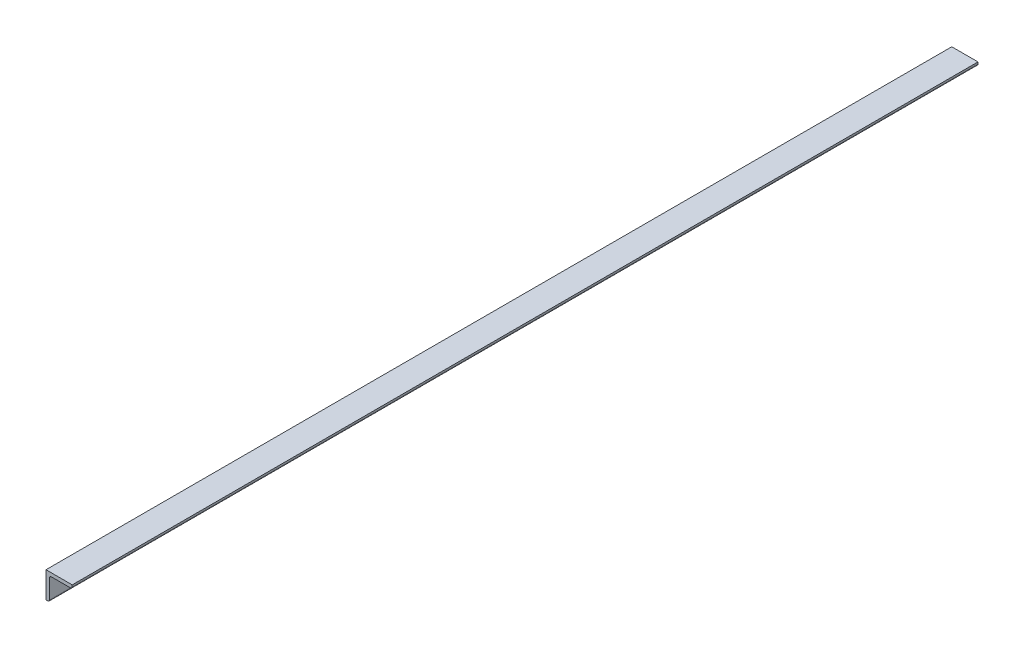
ISO-10303-21;
HEADER;
FILE_DESCRIPTION(('STEP AP214'),'2;1');
FILE_NAME('part.step','',(''),(''),'','','');
FILE_SCHEMA(('AUTOMOTIVE_DESIGN { 1 0 10303 214 1 1 1 1 }'));
ENDSEC;
DATA;
#1=APPLICATION_CONTEXT('core data for automotive mechanical design processes');
#2=APPLICATION_PROTOCOL_DEFINITION('international standard','automotive_design',2000,#1);
#3=PRODUCT_CONTEXT('',#1,'mechanical');
#4=PRODUCT('Part','Part','',(#3));
#5=PRODUCT_RELATED_PRODUCT_CATEGORY('part','',(#4));
#6=PRODUCT_DEFINITION_FORMATION('','',#4);
#7=PRODUCT_DEFINITION_CONTEXT('part definition',#1,'design');
#8=PRODUCT_DEFINITION('design','',#6,#7);
#9=PRODUCT_DEFINITION_SHAPE('','',#8);
#10=(LENGTH_UNIT() NAMED_UNIT(*) SI_UNIT(.MILLI.,.METRE.));
#11=(NAMED_UNIT(*) PLANE_ANGLE_UNIT() SI_UNIT($,.RADIAN.));
#12=(NAMED_UNIT(*) SI_UNIT($,.STERADIAN.) SOLID_ANGLE_UNIT());
#13=UNCERTAINTY_MEASURE_WITH_UNIT(LENGTH_MEASURE(1.E-05),#10,'distance_accuracy_value','');
#14=(GEOMETRIC_REPRESENTATION_CONTEXT(3) GLOBAL_UNCERTAINTY_ASSIGNED_CONTEXT((#13)) GLOBAL_UNIT_ASSIGNED_CONTEXT((#10,
#11,#12)) REPRESENTATION_CONTEXT('',''));
#15=CARTESIAN_POINT('',(0.,0.,0.));
#16=DIRECTION('',(0.,0.,1.));
#17=DIRECTION('',(1.,0.,0.));
#18=AXIS2_PLACEMENT_3D('',#15,#16,#17);
#19=CARTESIAN_POINT('',(-8.62500000000004,36.8125,1036.));
#20=DIRECTION('',(-1.,0.,0.));
#21=DIRECTION('',(0.,0.,1.));
#22=AXIS2_PLACEMENT_3D('',#19,#20,#21);
#23=PLANE('',#22);
#24=DIRECTION('',(0.,1.,0.));
#25=VECTOR('',#24,1.);
#26=CARTESIAN_POINT('',(-8.62500000000004,36.8125,0.));
#27=LINE('',#26,#25);
#28=CARTESIAN_POINT('',(-8.62500000000004,36.8125,0.));
#29=VERTEX_POINT('',#28);
#30=CARTESIAN_POINT('',(-8.62500000000004,38.8125,0.));
#31=VERTEX_POINT('',#30);
#32=EDGE_CURVE('E135',#29,#31,#27,.T.);
#33=ORIENTED_EDGE('',*,*,#32,.T.);
#34=DIRECTION('',(0.,0.,-1.));
#35=VECTOR('',#34,1.);
#36=CARTESIAN_POINT('',(-8.62500000000004,38.8125,1036.));
#37=LINE('',#36,#35);
#38=CARTESIAN_POINT('',(-8.62500000000004,38.8125,1036.));
#39=VERTEX_POINT('',#38);
#40=EDGE_CURVE('E11',#39,#31,#37,.T.);
#41=ORIENTED_EDGE('',*,*,#40,.F.);
#42=DIRECTION('',(0.,1.,0.));
#43=VECTOR('',#42,1.);
#44=CARTESIAN_POINT('',(-8.62500000000004,36.8125,1036.));
#45=LINE('',#44,#43);
#46=CARTESIAN_POINT('',(-8.62500000000004,36.8125,1036.));
#47=VERTEX_POINT('',#46);
#48=EDGE_CURVE('E151',#47,#39,#45,.T.);
#49=ORIENTED_EDGE('',*,*,#48,.F.);
#50=DIRECTION('',(0.,0.,-1.));
#51=VECTOR('',#50,1.);
#52=CARTESIAN_POINT('',(-8.62500000000004,36.8125,1036.));
#53=LINE('',#52,#51);
#54=EDGE_CURVE('E131',#47,#29,#53,.T.);
#55=ORIENTED_EDGE('',*,*,#54,.T.);
#56=EDGE_LOOP('',(#33,#41,#49,#55));
#57=FACE_BOUND('',#56,.T.);
#58=ADVANCED_FACE('F33',(#57),#23,.F.);
#59=CARTESIAN_POINT('',(-8.62500000000004,38.8125,1036.));
#60=DIRECTION('',(0.,-1.,0.));
#61=DIRECTION('',(1.,0.,0.));
#62=AXIS2_PLACEMENT_3D('',#59,#60,#61);
#63=PLANE('',#62);
#64=DIRECTION('',(-1.,0.,0.));
#65=VECTOR('',#64,1.);
#66=CARTESIAN_POINT('',(-8.62500000000004,38.8125,0.));
#67=LINE('',#66,#65);
#68=CARTESIAN_POINT('',(-38.625,38.8125,0.));
#69=VERTEX_POINT('',#68);
#70=EDGE_CURVE('E138',#31,#69,#67,.T.);
#71=ORIENTED_EDGE('',*,*,#70,.T.);
#72=DIRECTION('',(0.,0.,-1.));
#73=VECTOR('',#72,1.);
#74=CARTESIAN_POINT('',(-38.625,38.8125,1036.));
#75=LINE('',#74,#73);
#76=CARTESIAN_POINT('',(-38.625,38.8125,1036.));
#77=VERTEX_POINT('',#76);
#78=EDGE_CURVE('E41',#77,#69,#75,.T.);
#79=ORIENTED_EDGE('',*,*,#78,.F.);
#80=DIRECTION('',(-1.,0.,0.));
#81=VECTOR('',#80,1.);
#82=CARTESIAN_POINT('',(-8.62500000000004,38.8125,1036.));
#83=LINE('',#82,#81);
#84=EDGE_CURVE('E95',#39,#77,#83,.T.);
#85=ORIENTED_EDGE('',*,*,#84,.F.);
#86=ORIENTED_EDGE('',*,*,#40,.T.);
#87=EDGE_LOOP('',(#71,#79,#85,#86));
#88=FACE_BOUND('',#87,.T.);
#89=ADVANCED_FACE('F194',(#88),#63,.F.);
#90=CARTESIAN_POINT('',(-38.625,38.8125,1036.));
#91=DIRECTION('',(1.,0.,0.));
#92=DIRECTION('',(0.,1.,0.));
#93=AXIS2_PLACEMENT_3D('',#90,#91,#92);
#94=PLANE('',#93);
#95=DIRECTION('',(0.,-1.,0.));
#96=VECTOR('',#95,1.);
#97=CARTESIAN_POINT('',(-38.625,38.8125,0.));
#98=LINE('',#97,#96);
#99=CARTESIAN_POINT('',(-38.625,8.81250000000001,0.));
#100=VERTEX_POINT('',#99);
#101=EDGE_CURVE('E140',#69,#100,#98,.T.);
#102=ORIENTED_EDGE('',*,*,#101,.T.);
#103=DIRECTION('',(0.,0.,-1.));
#104=VECTOR('',#103,1.);
#105=CARTESIAN_POINT('',(-38.625,8.81250000000001,1036.));
#106=LINE('',#105,#104);
#107=CARTESIAN_POINT('',(-38.625,8.81250000000001,1036.));
#108=VERTEX_POINT('',#107);
#109=EDGE_CURVE('E161',#108,#100,#106,.T.);
#110=ORIENTED_EDGE('',*,*,#109,.F.);
#111=DIRECTION('',(0.,-1.,0.));
#112=VECTOR('',#111,1.);
#113=CARTESIAN_POINT('',(-38.625,38.8125,1036.));
#114=LINE('',#113,#112);
#115=EDGE_CURVE('E169',#77,#108,#114,.T.);
#116=ORIENTED_EDGE('',*,*,#115,.F.);
#117=ORIENTED_EDGE('',*,*,#78,.T.);
#118=EDGE_LOOP('',(#102,#110,#116,#117));
#119=FACE_BOUND('',#118,.T.);
#120=ADVANCED_FACE('F167',(#119),#94,.F.);
#121=CARTESIAN_POINT('',(-38.625,8.81250000000001,1036.));
#122=DIRECTION('',(0.,1.,0.));
#123=DIRECTION('',(0.,0.,1.));
#124=AXIS2_PLACEMENT_3D('',#121,#122,#123);
#125=PLANE('',#124);
#126=DIRECTION('',(1.,0.,0.));
#127=VECTOR('',#126,1.);
#128=CARTESIAN_POINT('',(-38.625,8.81250000000001,0.));
#129=LINE('',#128,#127);
#130=CARTESIAN_POINT('',(-36.625,8.81250000000001,0.));
#131=VERTEX_POINT('',#130);
#132=EDGE_CURVE('E142',#100,#131,#129,.T.);
#133=ORIENTED_EDGE('',*,*,#132,.T.);
#134=DIRECTION('',(0.,0.,-1.));
#135=VECTOR('',#134,1.);
#136=CARTESIAN_POINT('',(-36.625,8.81250000000001,1036.));
#137=LINE('',#136,#135);
#138=CARTESIAN_POINT('',(-36.625,8.81250000000001,1036.));
#139=VERTEX_POINT('',#138);
#140=EDGE_CURVE('E158',#139,#131,#137,.T.);
#141=ORIENTED_EDGE('',*,*,#140,.F.);
#142=DIRECTION('',(1.,0.,0.));
#143=VECTOR('',#142,1.);
#144=CARTESIAN_POINT('',(-38.625,8.81250000000001,1036.));
#145=LINE('',#144,#143);
#146=EDGE_CURVE('E185',#108,#139,#145,.T.);
#147=ORIENTED_EDGE('',*,*,#146,.F.);
#148=ORIENTED_EDGE('',*,*,#109,.T.);
#149=EDGE_LOOP('',(#133,#141,#147,#148));
#150=FACE_BOUND('',#149,.T.);
#151=ADVANCED_FACE('F178',(#150),#125,.F.);
#152=CARTESIAN_POINT('',(-36.625,10.8125,1036.));
#153=DIRECTION('',(0.,0.,-1.));
#154=DIRECTION('',(-1.,0.,0.));
#155=AXIS2_PLACEMENT_3D('',#152,#153,#154);
#156=CYLINDRICAL_SURFACE('',#155,2.);
#157=CARTESIAN_POINT('',(-36.625,10.8125,0.));
#158=DIRECTION('',(0.,0.,1.));
#159=DIRECTION('',(1.,0.,0.));
#160=AXIS2_PLACEMENT_3D('',#157,#158,#159);
#161=CIRCLE('',#160,2.);
#162=CARTESIAN_POINT('',(-34.625,10.8125,0.));
#163=VERTEX_POINT('',#162);
#164=EDGE_CURVE('E144',#131,#163,#161,.T.);
#165=ORIENTED_EDGE('',*,*,#164,.T.);
#166=DIRECTION('',(0.,0.,-1.));
#167=VECTOR('',#166,1.);
#168=CARTESIAN_POINT('',(-34.625,10.8125,1036.));
#169=LINE('',#168,#167);
#170=CARTESIAN_POINT('',(-34.625,10.8125,1036.));
#171=VERTEX_POINT('',#170);
#172=EDGE_CURVE('E155',#171,#163,#169,.T.);
#173=ORIENTED_EDGE('',*,*,#172,.F.);
#174=CARTESIAN_POINT('',(-36.625,10.8125,1036.));
#175=DIRECTION('',(0.,0.,1.));
#176=DIRECTION('',(1.,0.,0.));
#177=AXIS2_PLACEMENT_3D('',#174,#175,#176);
#178=CIRCLE('',#177,2.);
#179=EDGE_CURVE('E184',#139,#171,#178,.T.);
#180=ORIENTED_EDGE('',*,*,#179,.F.);
#181=ORIENTED_EDGE('',*,*,#140,.T.);
#182=EDGE_LOOP('',(#165,#173,#180,#181));
#183=FACE_BOUND('',#182,.T.);
#184=ADVANCED_FACE('F182',(#183),#156,.T.);
#185=CARTESIAN_POINT('',(-34.625,10.8125,1036.));
#186=DIRECTION('',(-1.,0.,0.));
#187=DIRECTION('',(0.,0.,1.));
#188=AXIS2_PLACEMENT_3D('',#185,#186,#187);
#189=PLANE('',#188);
#190=DIRECTION('',(0.,1.,0.));
#191=VECTOR('',#190,1.);
#192=CARTESIAN_POINT('',(-34.625,10.8125,0.));
#193=LINE('',#192,#191);
#194=CARTESIAN_POINT('',(-34.625,32.8125,0.));
#195=VERTEX_POINT('',#194);
#196=EDGE_CURVE('E146',#163,#195,#193,.T.);
#197=ORIENTED_EDGE('',*,*,#196,.T.);
#198=DIRECTION('',(0.,0.,-1.));
#199=VECTOR('',#198,1.);
#200=CARTESIAN_POINT('',(-34.625,32.8125,1036.));
#201=LINE('',#200,#199);
#202=CARTESIAN_POINT('',(-34.625,32.8125,1036.));
#203=VERTEX_POINT('',#202);
#204=EDGE_CURVE('E126',#203,#195,#201,.T.);
#205=ORIENTED_EDGE('',*,*,#204,.F.);
#206=DIRECTION('',(0.,1.,0.));
#207=VECTOR('',#206,1.);
#208=CARTESIAN_POINT('',(-34.625,10.8125,1036.));
#209=LINE('',#208,#207);
#210=EDGE_CURVE('E117',#171,#203,#209,.T.);
#211=ORIENTED_EDGE('',*,*,#210,.F.);
#212=ORIENTED_EDGE('',*,*,#172,.T.);
#213=EDGE_LOOP('',(#197,#205,#211,#212));
#214=FACE_BOUND('',#213,.T.);
#215=ADVANCED_FACE('F206',(#214),#189,.F.);
#216=CARTESIAN_POINT('',(-32.625,32.8125,1036.));
#217=DIRECTION('',(0.,0.,-1.));
#218=DIRECTION('',(-1.,0.,0.));
#219=AXIS2_PLACEMENT_3D('',#216,#217,#218);
#220=CYLINDRICAL_SURFACE('',#219,2.);
#221=CARTESIAN_POINT('',(-32.625,32.8125,0.));
#222=DIRECTION('',(0.,0.,-1.));
#223=DIRECTION('',(-1.,0.,0.));
#224=AXIS2_PLACEMENT_3D('',#221,#222,#223);
#225=CIRCLE('',#224,2.);
#226=CARTESIAN_POINT('',(-32.625,34.8125,0.));
#227=VERTEX_POINT('',#226);
#228=EDGE_CURVE('E125',#195,#227,#225,.T.);
#229=ORIENTED_EDGE('',*,*,#228,.T.);
#230=DIRECTION('',(0.,0.,-1.));
#231=VECTOR('',#230,1.);
#232=CARTESIAN_POINT('',(-32.625,34.8125,1036.));
#233=LINE('',#232,#231);
#234=CARTESIAN_POINT('',(-32.625,34.8125,1036.));
#235=VERTEX_POINT('',#234);
#236=EDGE_CURVE('E122',#235,#227,#233,.T.);
#237=ORIENTED_EDGE('',*,*,#236,.F.);
#238=CARTESIAN_POINT('',(-32.625,32.8125,1036.));
#239=DIRECTION('',(0.,0.,-1.));
#240=DIRECTION('',(-1.,0.,0.));
#241=AXIS2_PLACEMENT_3D('',#238,#239,#240);
#242=CIRCLE('',#241,2.);
#243=EDGE_CURVE('E111',#203,#235,#242,.T.);
#244=ORIENTED_EDGE('',*,*,#243,.F.);
#245=ORIENTED_EDGE('',*,*,#204,.T.);
#246=EDGE_LOOP('',(#229,#237,#244,#245));
#247=FACE_BOUND('',#246,.T.);
#248=ADVANCED_FACE('F123',(#247),#220,.F.);
#249=CARTESIAN_POINT('',(-32.625,34.8125,1036.));
#250=DIRECTION('',(0.,1.,0.));
#251=DIRECTION('',(0.,0.,1.));
#252=AXIS2_PLACEMENT_3D('',#249,#250,#251);
#253=PLANE('',#252);
#254=DIRECTION('',(1.,0.,0.));
#255=VECTOR('',#254,1.);
#256=CARTESIAN_POINT('',(-32.625,34.8125,0.));
#257=LINE('',#256,#255);
#258=CARTESIAN_POINT('',(-10.625,34.8125,0.));
#259=VERTEX_POINT('',#258);
#260=EDGE_CURVE('E81',#227,#259,#257,.T.);
#261=ORIENTED_EDGE('',*,*,#260,.T.);
#262=DIRECTION('',(0.,0.,-1.));
#263=VECTOR('',#262,1.);
#264=CARTESIAN_POINT('',(-10.625,34.8125,1036.));
#265=LINE('',#264,#263);
#266=CARTESIAN_POINT('',(-10.625,34.8125,1036.));
#267=VERTEX_POINT('',#266);
#268=EDGE_CURVE('E127',#267,#259,#265,.T.);
#269=ORIENTED_EDGE('',*,*,#268,.F.);
#270=DIRECTION('',(1.,0.,0.));
#271=VECTOR('',#270,1.);
#272=CARTESIAN_POINT('',(-32.625,34.8125,1036.));
#273=LINE('',#272,#271);
#274=EDGE_CURVE('E115',#235,#267,#273,.T.);
#275=ORIENTED_EDGE('',*,*,#274,.F.);
#276=ORIENTED_EDGE('',*,*,#236,.T.);
#277=EDGE_LOOP('',(#261,#269,#275,#276));
#278=FACE_BOUND('',#277,.T.);
#279=ADVANCED_FACE('F129',(#278),#253,.F.);
#280=CARTESIAN_POINT('',(-10.625,36.8125,1036.));
#281=DIRECTION('',(0.,0.,-1.));
#282=DIRECTION('',(-1.,0.,0.));
#283=AXIS2_PLACEMENT_3D('',#280,#281,#282);
#284=CYLINDRICAL_SURFACE('',#283,2.);
#285=CARTESIAN_POINT('',(-10.625,36.8125,0.));
#286=DIRECTION('',(0.,0.,1.));
#287=DIRECTION('',(1.,0.,0.));
#288=AXIS2_PLACEMENT_3D('',#285,#286,#287);
#289=CIRCLE('',#288,2.);
#290=EDGE_CURVE('E87',#259,#29,#289,.T.);
#291=ORIENTED_EDGE('',*,*,#290,.T.);
#292=ORIENTED_EDGE('',*,*,#54,.F.);
#293=CARTESIAN_POINT('',(-10.625,36.8125,1036.));
#294=DIRECTION('',(0.,0.,1.));
#295=DIRECTION('',(1.,0.,0.));
#296=AXIS2_PLACEMENT_3D('',#293,#294,#295);
#297=CIRCLE('',#296,2.);
#298=EDGE_CURVE('E49',#267,#47,#297,.T.);
#299=ORIENTED_EDGE('',*,*,#298,.F.);
#300=ORIENTED_EDGE('',*,*,#268,.T.);
#301=EDGE_LOOP('',(#291,#292,#299,#300));
#302=FACE_BOUND('',#301,.T.);
#303=ADVANCED_FACE('F214',(#302),#284,.T.);
#304=CARTESIAN_POINT('',(-36.625,10.8125,1036.));
#305=DIRECTION('',(0.,0.,1.));
#306=DIRECTION('',(1.,0.,0.));
#307=AXIS2_PLACEMENT_3D('',#304,#305,#306);
#308=PLANE('',#307);
#309=ORIENTED_EDGE('',*,*,#48,.T.);
#310=ORIENTED_EDGE('',*,*,#84,.T.);
#311=ORIENTED_EDGE('',*,*,#115,.T.);
#312=ORIENTED_EDGE('',*,*,#146,.T.);
#313=ORIENTED_EDGE('',*,*,#179,.T.);
#314=ORIENTED_EDGE('',*,*,#210,.T.);
#315=ORIENTED_EDGE('',*,*,#243,.T.);
#316=ORIENTED_EDGE('',*,*,#274,.T.);
#317=ORIENTED_EDGE('',*,*,#298,.T.);
#318=EDGE_LOOP('',(#309,#310,#311,#312,#313,#314,#315,#316,#317));
#319=FACE_BOUND('',#318,.T.);
#320=ADVANCED_FACE('F113',(#319),#308,.T.);
#321=CARTESIAN_POINT('',(-36.625,10.8125,0.));
#322=DIRECTION('',(0.,0.,1.));
#323=DIRECTION('',(1.,0.,0.));
#324=AXIS2_PLACEMENT_3D('',#321,#322,#323);
#325=PLANE('',#324);
#326=ORIENTED_EDGE('',*,*,#32,.F.);
#327=ORIENTED_EDGE('',*,*,#290,.F.);
#328=ORIENTED_EDGE('',*,*,#260,.F.);
#329=ORIENTED_EDGE('',*,*,#228,.F.);
#330=ORIENTED_EDGE('',*,*,#196,.F.);
#331=ORIENTED_EDGE('',*,*,#164,.F.);
#332=ORIENTED_EDGE('',*,*,#132,.F.);
#333=ORIENTED_EDGE('',*,*,#101,.F.);
#334=ORIENTED_EDGE('',*,*,#70,.F.);
#335=EDGE_LOOP('',(#326,#327,#328,#329,#330,#331,#332,#333,#334));
#336=FACE_BOUND('',#335,.T.);
#337=ADVANCED_FACE('F173',(#336),#325,.F.);
#338=CLOSED_SHELL('',(#58,#89,#120,#151,#184,#215,#248,#279,#303,#320,#337));
#339=MANIFOLD_SOLID_BREP('B2',#338);
#340=ADVANCED_BREP_SHAPE_REPRESENTATION('',(#18,#339),#14);
#341=SHAPE_DEFINITION_REPRESENTATION(#9,#340);
ENDSEC;
END-ISO-10303-21;
